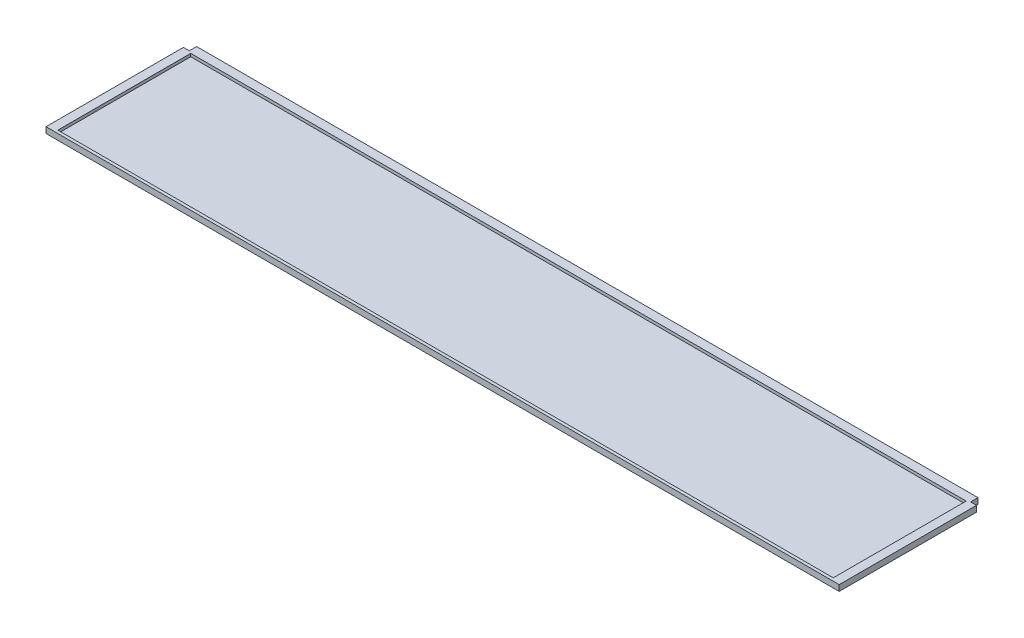
ISO-10303-21;
HEADER;
FILE_DESCRIPTION(('STEP AP214'),'2;1');
FILE_NAME('part.step','',(''),(''),'','','');
FILE_SCHEMA(('AUTOMOTIVE_DESIGN { 1 0 10303 214 1 1 1 1 }'));
ENDSEC;
DATA;
#1=APPLICATION_CONTEXT('core data for automotive mechanical design processes');
#2=APPLICATION_PROTOCOL_DEFINITION('international standard','automotive_design',2000,#1);
#3=PRODUCT_CONTEXT('',#1,'mechanical');
#4=PRODUCT('Part','Part','',(#3));
#5=PRODUCT_RELATED_PRODUCT_CATEGORY('part','',(#4));
#6=PRODUCT_DEFINITION_FORMATION('','',#4);
#7=PRODUCT_DEFINITION_CONTEXT('part definition',#1,'design');
#8=PRODUCT_DEFINITION('design','',#6,#7);
#9=PRODUCT_DEFINITION_SHAPE('','',#8);
#10=(LENGTH_UNIT() NAMED_UNIT(*) SI_UNIT(.MILLI.,.METRE.));
#11=(NAMED_UNIT(*) PLANE_ANGLE_UNIT() SI_UNIT($,.RADIAN.));
#12=(NAMED_UNIT(*) SI_UNIT($,.STERADIAN.) SOLID_ANGLE_UNIT());
#13=UNCERTAINTY_MEASURE_WITH_UNIT(LENGTH_MEASURE(1.E-05),#10,'distance_accuracy_value','');
#14=(GEOMETRIC_REPRESENTATION_CONTEXT(3) GLOBAL_UNCERTAINTY_ASSIGNED_CONTEXT((#13)) GLOBAL_UNIT_ASSIGNED_CONTEXT((#10,
#11,#12)) REPRESENTATION_CONTEXT('',''));
#15=CARTESIAN_POINT('',(0.,0.,0.));
#16=DIRECTION('',(0.,0.,1.));
#17=DIRECTION('',(1.,0.,0.));
#18=AXIS2_PLACEMENT_3D('',#15,#16,#17);
#19=CARTESIAN_POINT('',(-118.285145625783,4.,-60.968067940552));
#20=DIRECTION('',(1.,0.,0.));
#21=DIRECTION('',(0.,0.,-1.));
#22=AXIS2_PLACEMENT_3D('',#19,#20,#21);
#23=PLANE('',#22);
#24=DIRECTION('',(0.,0.,1.));
#25=VECTOR('',#24,1.);
#26=CARTESIAN_POINT('',(-118.285145625783,4.,-60.968067940552));
#27=LINE('',#26,#25);
#28=CARTESIAN_POINT('',(-118.285145625783,4.,-55.968067940552));
#29=VERTEX_POINT('',#28);
#30=CARTESIAN_POINT('',(-118.285145625783,4.,37.031932059448));
#31=VERTEX_POINT('',#30);
#32=EDGE_CURVE('E144',#29,#31,#27,.T.);
#33=ORIENTED_EDGE('',*,*,#32,.F.);
#34=DIRECTION('',(0.,1.,0.));
#35=VECTOR('',#34,1.);
#36=CARTESIAN_POINT('',(-118.285145625783,0.,-55.968067940552));
#37=LINE('',#36,#35);
#38=CARTESIAN_POINT('',(-118.285145625783,0.,-55.968067940552));
#39=VERTEX_POINT('',#38);
#40=EDGE_CURVE('E131',#39,#29,#37,.T.);
#41=ORIENTED_EDGE('',*,*,#40,.F.);
#42=DIRECTION('',(0.,0.,1.));
#43=VECTOR('',#42,1.);
#44=CARTESIAN_POINT('',(-118.285145625783,0.,-60.968067940552));
#45=LINE('',#44,#43);
#46=CARTESIAN_POINT('',(-118.285145625783,0.,37.031932059448));
#47=VERTEX_POINT('',#46);
#48=EDGE_CURVE('E142',#39,#47,#45,.T.);
#49=ORIENTED_EDGE('',*,*,#48,.T.);
#50=DIRECTION('',(0.,-1.,0.));
#51=VECTOR('',#50,1.);
#52=CARTESIAN_POINT('',(-118.285145625783,4.,37.031932059448));
#53=LINE('',#52,#51);
#54=EDGE_CURVE('E11',#31,#47,#53,.T.);
#55=ORIENTED_EDGE('',*,*,#54,.F.);
#56=EDGE_LOOP('',(#33,#41,#49,#55));
#57=FACE_BOUND('',#56,.T.);
#58=ADVANCED_FACE('F39',(#57),#23,.F.);
#59=CARTESIAN_POINT('',(-118.285145625783,4.,37.031932059448));
#60=DIRECTION('',(0.,0.,-1.));
#61=DIRECTION('',(-1.,0.,0.));
#62=AXIS2_PLACEMENT_3D('',#59,#60,#61);
#63=PLANE('',#62);
#64=DIRECTION('',(1.,0.,0.));
#65=VECTOR('',#64,1.);
#66=CARTESIAN_POINT('',(-118.285145625783,0.,37.031932059448));
#67=LINE('',#66,#65);
#68=CARTESIAN_POINT('',(418.714854374217,0.,37.031932059448));
#69=VERTEX_POINT('',#68);
#70=EDGE_CURVE('E149',#47,#69,#67,.T.);
#71=ORIENTED_EDGE('',*,*,#70,.T.);
#72=DIRECTION('',(0.,-1.,0.));
#73=VECTOR('',#72,1.);
#74=CARTESIAN_POINT('',(418.714854374217,4.,37.031932059448));
#75=LINE('',#74,#73);
#76=CARTESIAN_POINT('',(418.714854374217,4.,37.031932059448));
#77=VERTEX_POINT('',#76);
#78=EDGE_CURVE('E47',#77,#69,#75,.T.);
#79=ORIENTED_EDGE('',*,*,#78,.F.);
#80=DIRECTION('',(1.,0.,0.));
#81=VECTOR('',#80,1.);
#82=CARTESIAN_POINT('',(-118.285145625783,4.,37.031932059448));
#83=LINE('',#82,#81);
#84=EDGE_CURVE('E183',#31,#77,#83,.T.);
#85=ORIENTED_EDGE('',*,*,#84,.F.);
#86=ORIENTED_EDGE('',*,*,#54,.T.);
#87=EDGE_LOOP('',(#71,#79,#85,#86));
#88=FACE_BOUND('',#87,.T.);
#89=ADVANCED_FACE('F276',(#88),#63,.F.);
#90=CARTESIAN_POINT('',(418.714854374217,4.,-60.968067940552));
#91=DIRECTION('',(-1.,0.,0.));
#92=DIRECTION('',(0.,0.,1.));
#93=AXIS2_PLACEMENT_3D('',#90,#91,#92);
#94=PLANE('',#93);
#95=DIRECTION('',(0.,0.,-1.));
#96=VECTOR('',#95,1.);
#97=CARTESIAN_POINT('',(418.714854374217,0.,-60.968067940552));
#98=LINE('',#97,#96);
#99=CARTESIAN_POINT('',(418.714854374217,0.,-55.968067940552));
#100=VERTEX_POINT('',#99);
#101=EDGE_CURVE('E155',#69,#100,#98,.T.);
#102=ORIENTED_EDGE('',*,*,#101,.T.);
#103=DIRECTION('',(0.,1.,0.));
#104=VECTOR('',#103,1.);
#105=CARTESIAN_POINT('',(418.714854374217,0.,-55.968067940552));
#106=LINE('',#105,#104);
#107=CARTESIAN_POINT('',(418.714854374217,4.,-55.968067940552));
#108=VERTEX_POINT('',#107);
#109=EDGE_CURVE('E237',#100,#108,#106,.T.);
#110=ORIENTED_EDGE('',*,*,#109,.T.);
#111=DIRECTION('',(0.,0.,-1.));
#112=VECTOR('',#111,1.);
#113=CARTESIAN_POINT('',(418.714854374217,4.,-60.968067940552));
#114=LINE('',#113,#112);
#115=EDGE_CURVE('E176',#77,#108,#114,.T.);
#116=ORIENTED_EDGE('',*,*,#115,.F.);
#117=ORIENTED_EDGE('',*,*,#78,.T.);
#118=EDGE_LOOP('',(#102,#110,#116,#117));
#119=FACE_BOUND('',#118,.T.);
#120=ADVANCED_FACE('F274',(#119),#94,.F.);
#121=CARTESIAN_POINT('',(-118.285145625783,4.,-60.968067940552));
#122=DIRECTION('',(0.,0.,1.));
#123=DIRECTION('',(1.,0.,0.));
#124=AXIS2_PLACEMENT_3D('',#121,#122,#123);
#125=PLANE('',#124);
#126=DIRECTION('',(-1.,0.,0.));
#127=VECTOR('',#126,1.);
#128=CARTESIAN_POINT('',(-118.285145625783,0.,-60.968067940552));
#129=LINE('',#128,#127);
#130=CARTESIAN_POINT('',(414.714854374217,0.,-60.968067940552));
#131=VERTEX_POINT('',#130);
#132=CARTESIAN_POINT('',(-114.285145625783,0.,-60.968067940552));
#133=VERTEX_POINT('',#132);
#134=EDGE_CURVE('E166',#131,#133,#129,.T.);
#135=ORIENTED_EDGE('',*,*,#134,.T.);
#136=DIRECTION('',(0.,1.,0.));
#137=VECTOR('',#136,1.);
#138=CARTESIAN_POINT('',(-114.285145625783,0.,-60.968067940552));
#139=LINE('',#138,#137);
#140=CARTESIAN_POINT('',(-114.285145625783,4.,-60.968067940552));
#141=VERTEX_POINT('',#140);
#142=EDGE_CURVE('E216',#133,#141,#139,.T.);
#143=ORIENTED_EDGE('',*,*,#142,.T.);
#144=DIRECTION('',(-1.,0.,0.));
#145=VECTOR('',#144,1.);
#146=CARTESIAN_POINT('',(-118.285145625783,4.,-60.968067940552));
#147=LINE('',#146,#145);
#148=CARTESIAN_POINT('',(414.714854374217,4.,-60.968067940552));
#149=VERTEX_POINT('',#148);
#150=EDGE_CURVE('E160',#149,#141,#147,.T.);
#151=ORIENTED_EDGE('',*,*,#150,.F.);
#152=DIRECTION('',(0.,1.,0.));
#153=VECTOR('',#152,1.);
#154=CARTESIAN_POINT('',(414.714854374217,0.,-60.968067940552));
#155=LINE('',#154,#153);
#156=EDGE_CURVE('E231',#131,#149,#155,.T.);
#157=ORIENTED_EDGE('',*,*,#156,.F.);
#158=EDGE_LOOP('',(#135,#143,#151,#157));
#159=FACE_BOUND('',#158,.T.);
#160=ADVANCED_FACE('F268',(#159),#125,.F.);
#161=CARTESIAN_POINT('',(0.,4.,0.));
#162=DIRECTION('',(0.,1.,0.));
#163=DIRECTION('',(0.,0.,1.));
#164=AXIS2_PLACEMENT_3D('',#161,#162,#163);
#165=PLANE('',#164);
#166=DIRECTION('',(0.,0.,-1.));
#167=VECTOR('',#166,1.);
#168=CARTESIAN_POINT('',(-114.285145625783,4.,-60.968067940552));
#169=LINE('',#168,#167);
#170=CARTESIAN_POINT('',(-114.285145625783,4.,-55.968067940552));
#171=VERTEX_POINT('',#170);
#172=EDGE_CURVE('E137',#171,#141,#169,.T.);
#173=ORIENTED_EDGE('',*,*,#172,.F.);
#174=DIRECTION('',(1.,0.,0.));
#175=VECTOR('',#174,1.);
#176=CARTESIAN_POINT('',(-118.285145625783,4.,-55.968067940552));
#177=LINE('',#176,#175);
#178=EDGE_CURVE('E241',#29,#171,#177,.T.);
#179=ORIENTED_EDGE('',*,*,#178,.F.);
#180=ORIENTED_EDGE('',*,*,#32,.T.);
#181=ORIENTED_EDGE('',*,*,#84,.T.);
#182=ORIENTED_EDGE('',*,*,#115,.T.);
#183=DIRECTION('',(1.,0.,0.));
#184=VECTOR('',#183,1.);
#185=CARTESIAN_POINT('',(418.714854374217,4.,-55.968067940552));
#186=LINE('',#185,#184);
#187=CARTESIAN_POINT('',(414.714854374217,4.,-55.968067940552));
#188=VERTEX_POINT('',#187);
#189=EDGE_CURVE('E242',#188,#108,#186,.T.);
#190=ORIENTED_EDGE('',*,*,#189,.F.);
#191=DIRECTION('',(0.,0.,1.));
#192=VECTOR('',#191,1.);
#193=CARTESIAN_POINT('',(414.714854374217,4.,-60.968067940552));
#194=LINE('',#193,#192);
#195=EDGE_CURVE('E246',#149,#188,#194,.T.);
#196=ORIENTED_EDGE('',*,*,#195,.F.);
#197=ORIENTED_EDGE('',*,*,#150,.T.);
#198=EDGE_LOOP('',(#173,#179,#180,#181,#182,#190,#196,#197));
#199=FACE_BOUND('',#198,.T.);
#200=DIRECTION('',(0.,0.,1.));
#201=VECTOR('',#200,1.);
#202=CARTESIAN_POINT('',(-112.285145625783,4.,-54.968067940552));
#203=LINE('',#202,#201);
#204=CARTESIAN_POINT('',(-112.285145625783,4.,-54.968067940552));
#205=VERTEX_POINT('',#204);
#206=CARTESIAN_POINT('',(-112.285145625783,4.,35.031932059448));
#207=VERTEX_POINT('',#206);
#208=EDGE_CURVE('E213',#205,#207,#203,.T.);
#209=ORIENTED_EDGE('',*,*,#208,.F.);
#210=DIRECTION('',(-1.,0.,0.));
#211=VECTOR('',#210,1.);
#212=CARTESIAN_POINT('',(-112.285145625783,4.,-54.968067940552));
#213=LINE('',#212,#211);
#214=CARTESIAN_POINT('',(412.714854374217,4.,-54.968067940552));
#215=VERTEX_POINT('',#214);
#216=EDGE_CURVE('E200',#215,#205,#213,.T.);
#217=ORIENTED_EDGE('',*,*,#216,.F.);
#218=DIRECTION('',(0.,0.,-1.));
#219=VECTOR('',#218,1.);
#220=CARTESIAN_POINT('',(412.714854374217,4.,-54.968067940552));
#221=LINE('',#220,#219);
#222=CARTESIAN_POINT('',(412.714854374217,4.,35.031932059448));
#223=VERTEX_POINT('',#222);
#224=EDGE_CURVE('E205',#223,#215,#221,.T.);
#225=ORIENTED_EDGE('',*,*,#224,.F.);
#226=DIRECTION('',(1.,0.,0.));
#227=VECTOR('',#226,1.);
#228=CARTESIAN_POINT('',(-112.285145625783,4.,35.031932059448));
#229=LINE('',#228,#227);
#230=EDGE_CURVE('E209',#207,#223,#229,.T.);
#231=ORIENTED_EDGE('',*,*,#230,.F.);
#232=EDGE_LOOP('',(#209,#217,#225,#231));
#233=FACE_BOUND('',#232,.T.);
#234=ADVANCED_FACE('F271',(#199,#233),#165,.T.);
#235=CARTESIAN_POINT('',(0.,0.,0.));
#236=DIRECTION('',(0.,1.,0.));
#237=DIRECTION('',(0.,0.,1.));
#238=AXIS2_PLACEMENT_3D('',#235,#236,#237);
#239=PLANE('',#238);
#240=DIRECTION('',(1.,0.,0.));
#241=VECTOR('',#240,1.);
#242=CARTESIAN_POINT('',(-118.285145625783,0.,-55.968067940552));
#243=LINE('',#242,#241);
#244=CARTESIAN_POINT('',(-114.285145625783,0.,-55.968067940552));
#245=VERTEX_POINT('',#244);
#246=EDGE_CURVE('E127',#39,#245,#243,.T.);
#247=ORIENTED_EDGE('',*,*,#246,.T.);
#248=DIRECTION('',(0.,0.,-1.));
#249=VECTOR('',#248,1.);
#250=CARTESIAN_POINT('',(-114.285145625783,0.,-60.968067940552));
#251=LINE('',#250,#249);
#252=EDGE_CURVE('E54',#245,#133,#251,.T.);
#253=ORIENTED_EDGE('',*,*,#252,.T.);
#254=ORIENTED_EDGE('',*,*,#134,.F.);
#255=DIRECTION('',(0.,0.,1.));
#256=VECTOR('',#255,1.);
#257=CARTESIAN_POINT('',(414.714854374217,0.,-60.968067940552));
#258=LINE('',#257,#256);
#259=CARTESIAN_POINT('',(414.714854374217,0.,-55.968067940552));
#260=VERTEX_POINT('',#259);
#261=EDGE_CURVE('E245',#131,#260,#258,.T.);
#262=ORIENTED_EDGE('',*,*,#261,.T.);
#263=DIRECTION('',(1.,0.,0.));
#264=VECTOR('',#263,1.);
#265=CARTESIAN_POINT('',(418.714854374217,0.,-55.968067940552));
#266=LINE('',#265,#264);
#267=EDGE_CURVE('E62',#260,#100,#266,.T.);
#268=ORIENTED_EDGE('',*,*,#267,.T.);
#269=ORIENTED_EDGE('',*,*,#101,.F.);
#270=ORIENTED_EDGE('',*,*,#70,.F.);
#271=ORIENTED_EDGE('',*,*,#48,.F.);
#272=EDGE_LOOP('',(#247,#253,#254,#262,#268,#269,#270,#271));
#273=FACE_BOUND('',#272,.T.);
#274=ADVANCED_FACE('F147',(#273),#239,.F.);
#275=CARTESIAN_POINT('',(-112.285145625783,2.,-54.968067940552));
#276=DIRECTION('',(-1.,0.,0.));
#277=DIRECTION('',(0.,0.,1.));
#278=AXIS2_PLACEMENT_3D('',#275,#276,#277);
#279=PLANE('',#278);
#280=ORIENTED_EDGE('',*,*,#208,.T.);
#281=DIRECTION('',(0.,1.,0.));
#282=VECTOR('',#281,1.);
#283=CARTESIAN_POINT('',(-112.285145625783,2.,35.031932059448));
#284=LINE('',#283,#282);
#285=CARTESIAN_POINT('',(-112.285145625783,2.,35.031932059448));
#286=VERTEX_POINT('',#285);
#287=EDGE_CURVE('E190',#286,#207,#284,.T.);
#288=ORIENTED_EDGE('',*,*,#287,.F.);
#289=DIRECTION('',(0.,0.,1.));
#290=VECTOR('',#289,1.);
#291=CARTESIAN_POINT('',(-112.285145625783,2.,-54.968067940552));
#292=LINE('',#291,#290);
#293=CARTESIAN_POINT('',(-112.285145625783,2.,-54.968067940552));
#294=VERTEX_POINT('',#293);
#295=EDGE_CURVE('E204',#294,#286,#292,.T.);
#296=ORIENTED_EDGE('',*,*,#295,.F.);
#297=DIRECTION('',(0.,1.,0.));
#298=VECTOR('',#297,1.);
#299=CARTESIAN_POINT('',(-112.285145625783,2.,-54.968067940552));
#300=LINE('',#299,#298);
#301=EDGE_CURVE('E151',#294,#205,#300,.T.);
#302=ORIENTED_EDGE('',*,*,#301,.T.);
#303=EDGE_LOOP('',(#280,#288,#296,#302));
#304=FACE_BOUND('',#303,.T.);
#305=ADVANCED_FACE('F298',(#304),#279,.F.);
#306=CARTESIAN_POINT('',(-112.285145625783,2.,-54.968067940552));
#307=DIRECTION('',(0.,0.,-1.));
#308=DIRECTION('',(-1.,0.,0.));
#309=AXIS2_PLACEMENT_3D('',#306,#307,#308);
#310=PLANE('',#309);
#311=ORIENTED_EDGE('',*,*,#216,.T.);
#312=ORIENTED_EDGE('',*,*,#301,.F.);
#313=DIRECTION('',(-1.,0.,0.));
#314=VECTOR('',#313,1.);
#315=CARTESIAN_POINT('',(-112.285145625783,2.,-54.968067940552));
#316=LINE('',#315,#314);
#317=CARTESIAN_POINT('',(412.714854374217,2.,-54.968067940552));
#318=VERTEX_POINT('',#317);
#319=EDGE_CURVE('E195',#318,#294,#316,.T.);
#320=ORIENTED_EDGE('',*,*,#319,.F.);
#321=DIRECTION('',(0.,1.,0.));
#322=VECTOR('',#321,1.);
#323=CARTESIAN_POINT('',(412.714854374217,2.,-54.968067940552));
#324=LINE('',#323,#322);
#325=EDGE_CURVE('E157',#318,#215,#324,.T.);
#326=ORIENTED_EDGE('',*,*,#325,.T.);
#327=EDGE_LOOP('',(#311,#312,#320,#326));
#328=FACE_BOUND('',#327,.T.);
#329=ADVANCED_FACE('F303',(#328),#310,.F.);
#330=CARTESIAN_POINT('',(412.714854374217,2.,-54.968067940552));
#331=DIRECTION('',(1.,0.,0.));
#332=DIRECTION('',(0.,0.,-1.));
#333=AXIS2_PLACEMENT_3D('',#330,#331,#332);
#334=PLANE('',#333);
#335=ORIENTED_EDGE('',*,*,#224,.T.);
#336=ORIENTED_EDGE('',*,*,#325,.F.);
#337=DIRECTION('',(0.,0.,-1.));
#338=VECTOR('',#337,1.);
#339=CARTESIAN_POINT('',(412.714854374217,2.,-54.968067940552));
#340=LINE('',#339,#338);
#341=CARTESIAN_POINT('',(412.714854374217,2.,35.031932059448));
#342=VERTEX_POINT('',#341);
#343=EDGE_CURVE('E220',#342,#318,#340,.T.);
#344=ORIENTED_EDGE('',*,*,#343,.F.);
#345=DIRECTION('',(0.,1.,0.));
#346=VECTOR('',#345,1.);
#347=CARTESIAN_POINT('',(412.714854374217,2.,35.031932059448));
#348=LINE('',#347,#346);
#349=EDGE_CURVE('E194',#342,#223,#348,.T.);
#350=ORIENTED_EDGE('',*,*,#349,.T.);
#351=EDGE_LOOP('',(#335,#336,#344,#350));
#352=FACE_BOUND('',#351,.T.);
#353=ADVANCED_FACE('F315',(#352),#334,.F.);
#354=CARTESIAN_POINT('',(-112.285145625783,2.,35.031932059448));
#355=DIRECTION('',(0.,0.,1.));
#356=DIRECTION('',(1.,0.,0.));
#357=AXIS2_PLACEMENT_3D('',#354,#355,#356);
#358=PLANE('',#357);
#359=ORIENTED_EDGE('',*,*,#230,.T.);
#360=ORIENTED_EDGE('',*,*,#349,.F.);
#361=DIRECTION('',(1.,0.,0.));
#362=VECTOR('',#361,1.);
#363=CARTESIAN_POINT('',(-112.285145625783,2.,35.031932059448));
#364=LINE('',#363,#362);
#365=EDGE_CURVE('E224',#286,#342,#364,.T.);
#366=ORIENTED_EDGE('',*,*,#365,.F.);
#367=ORIENTED_EDGE('',*,*,#287,.T.);
#368=EDGE_LOOP('',(#359,#360,#366,#367));
#369=FACE_BOUND('',#368,.T.);
#370=ADVANCED_FACE('F325',(#369),#358,.F.);
#371=CARTESIAN_POINT('',(0.,2.,0.));
#372=DIRECTION('',(0.,1.,0.));
#373=DIRECTION('',(0.,0.,1.));
#374=AXIS2_PLACEMENT_3D('',#371,#372,#373);
#375=PLANE('',#374);
#376=ORIENTED_EDGE('',*,*,#295,.T.);
#377=ORIENTED_EDGE('',*,*,#365,.T.);
#378=ORIENTED_EDGE('',*,*,#343,.T.);
#379=ORIENTED_EDGE('',*,*,#319,.T.);
#380=EDGE_LOOP('',(#376,#377,#378,#379));
#381=FACE_BOUND('',#380,.T.);
#382=ADVANCED_FACE('F334',(#381),#375,.T.);
#383=CARTESIAN_POINT('',(418.714854374217,0.,-55.968067940552));
#384=DIRECTION('',(0.,0.,1.));
#385=DIRECTION('',(1.,0.,0.));
#386=AXIS2_PLACEMENT_3D('',#383,#384,#385);
#387=PLANE('',#386);
#388=ORIENTED_EDGE('',*,*,#189,.T.);
#389=ORIENTED_EDGE('',*,*,#109,.F.);
#390=ORIENTED_EDGE('',*,*,#267,.F.);
#391=DIRECTION('',(0.,1.,0.));
#392=VECTOR('',#391,1.);
#393=CARTESIAN_POINT('',(414.714854374217,0.,-55.968067940552));
#394=LINE('',#393,#392);
#395=EDGE_CURVE('E234',#260,#188,#394,.T.);
#396=ORIENTED_EDGE('',*,*,#395,.T.);
#397=EDGE_LOOP('',(#388,#389,#390,#396));
#398=FACE_BOUND('',#397,.T.);
#399=ADVANCED_FACE('F273',(#398),#387,.F.);
#400=CARTESIAN_POINT('',(414.714854374217,0.,-60.968067940552));
#401=DIRECTION('',(-1.,0.,0.));
#402=DIRECTION('',(0.,0.,1.));
#403=AXIS2_PLACEMENT_3D('',#400,#401,#402);
#404=PLANE('',#403);
#405=ORIENTED_EDGE('',*,*,#195,.T.);
#406=ORIENTED_EDGE('',*,*,#395,.F.);
#407=ORIENTED_EDGE('',*,*,#261,.F.);
#408=ORIENTED_EDGE('',*,*,#156,.T.);
#409=EDGE_LOOP('',(#405,#406,#407,#408));
#410=FACE_BOUND('',#409,.T.);
#411=ADVANCED_FACE('F270',(#410),#404,.F.);
#412=CARTESIAN_POINT('',(-114.285145625783,0.,-60.968067940552));
#413=DIRECTION('',(1.,0.,0.));
#414=DIRECTION('',(0.,0.,-1.));
#415=AXIS2_PLACEMENT_3D('',#412,#413,#414);
#416=PLANE('',#415);
#417=ORIENTED_EDGE('',*,*,#172,.T.);
#418=ORIENTED_EDGE('',*,*,#142,.F.);
#419=ORIENTED_EDGE('',*,*,#252,.F.);
#420=DIRECTION('',(0.,1.,0.));
#421=VECTOR('',#420,1.);
#422=CARTESIAN_POINT('',(-114.285145625783,0.,-55.968067940552));
#423=LINE('',#422,#421);
#424=EDGE_CURVE('E133',#245,#171,#423,.T.);
#425=ORIENTED_EDGE('',*,*,#424,.T.);
#426=EDGE_LOOP('',(#417,#418,#419,#425));
#427=FACE_BOUND('',#426,.T.);
#428=ADVANCED_FACE('F359',(#427),#416,.F.);
#429=CARTESIAN_POINT('',(-118.285145625783,0.,-55.968067940552));
#430=DIRECTION('',(0.,0.,1.));
#431=DIRECTION('',(1.,0.,0.));
#432=AXIS2_PLACEMENT_3D('',#429,#430,#431);
#433=PLANE('',#432);
#434=ORIENTED_EDGE('',*,*,#178,.T.);
#435=ORIENTED_EDGE('',*,*,#424,.F.);
#436=ORIENTED_EDGE('',*,*,#246,.F.);
#437=ORIENTED_EDGE('',*,*,#40,.T.);
#438=EDGE_LOOP('',(#434,#435,#436,#437));
#439=FACE_BOUND('',#438,.T.);
#440=ADVANCED_FACE('F130',(#439),#433,.F.);
#441=CLOSED_SHELL('',(#58,#89,#120,#160,#234,#274,#305,#329,#353,#370,#382,#399,#411,#428,#440));
#442=MANIFOLD_SOLID_BREP('B2',#441);
#443=ADVANCED_BREP_SHAPE_REPRESENTATION('',(#18,#442),#14);
#444=SHAPE_DEFINITION_REPRESENTATION(#9,#443);
ENDSEC;
END-ISO-10303-21;
